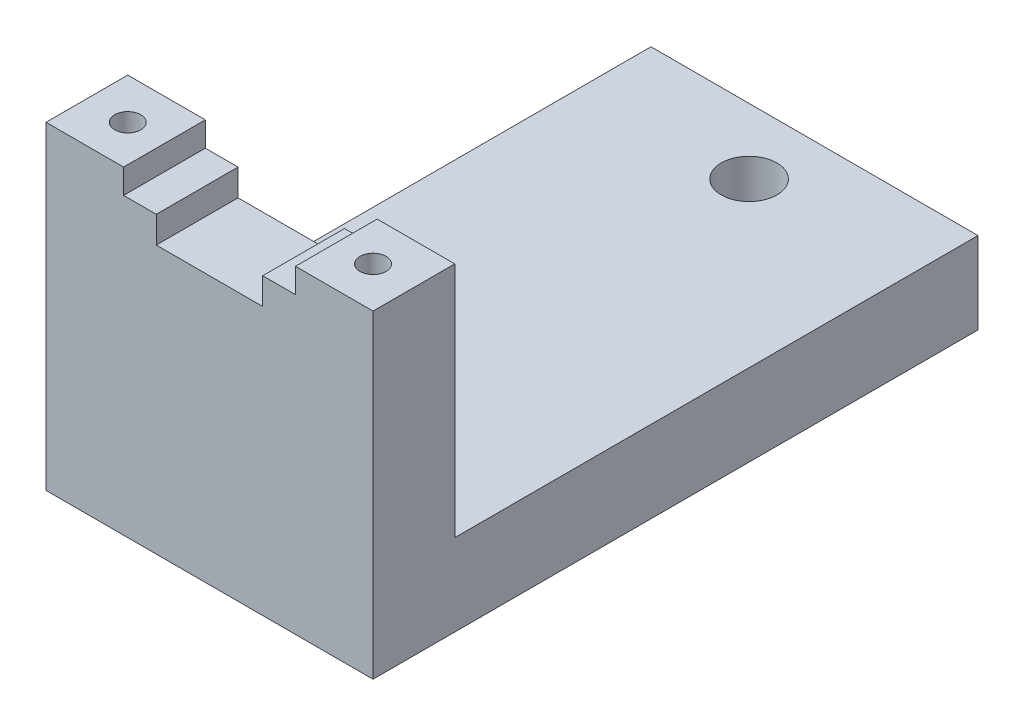
ISO-10303-21;
HEADER;
FILE_DESCRIPTION(('STEP AP214'),'2;1');
FILE_NAME('part.step','',(''),(''),'','','');
FILE_SCHEMA(('AUTOMOTIVE_DESIGN { 1 0 10303 214 1 1 1 1 }'));
ENDSEC;
DATA;
#1=APPLICATION_CONTEXT('core data for automotive mechanical design processes');
#2=APPLICATION_PROTOCOL_DEFINITION('international standard','automotive_design',2000,#1);
#3=PRODUCT_CONTEXT('',#1,'mechanical');
#4=PRODUCT('Part','Part','',(#3));
#5=PRODUCT_RELATED_PRODUCT_CATEGORY('part','',(#4));
#6=PRODUCT_DEFINITION_FORMATION('','',#4);
#7=PRODUCT_DEFINITION_CONTEXT('part definition',#1,'design');
#8=PRODUCT_DEFINITION('design','',#6,#7);
#9=PRODUCT_DEFINITION_SHAPE('','',#8);
#10=(LENGTH_UNIT() NAMED_UNIT(*) SI_UNIT(.MILLI.,.METRE.));
#11=(NAMED_UNIT(*) PLANE_ANGLE_UNIT() SI_UNIT($,.RADIAN.));
#12=(NAMED_UNIT(*) SI_UNIT($,.STERADIAN.) SOLID_ANGLE_UNIT());
#13=UNCERTAINTY_MEASURE_WITH_UNIT(LENGTH_MEASURE(1.E-05),#10,'distance_accuracy_value','');
#14=(GEOMETRIC_REPRESENTATION_CONTEXT(3) GLOBAL_UNCERTAINTY_ASSIGNED_CONTEXT((#13)) GLOBAL_UNIT_ASSIGNED_CONTEXT((#10,
#11,#12)) REPRESENTATION_CONTEXT('',''));
#15=CARTESIAN_POINT('',(0.,0.,0.));
#16=DIRECTION('',(0.,0.,1.));
#17=DIRECTION('',(1.,0.,0.));
#18=AXIS2_PLACEMENT_3D('',#15,#16,#17);
#19=CARTESIAN_POINT('',(5.255,18.,13.5));
#20=DIRECTION('',(0.,-1.,0.));
#21=DIRECTION('',(0.,0.,-1.));
#22=AXIS2_PLACEMENT_3D('',#19,#20,#21);
#23=PLANE('',#22);
#24=DIRECTION('',(-1.,0.,0.));
#25=VECTOR('',#24,1.);
#26=CARTESIAN_POINT('',(-5.255,18.,13.5));
#27=LINE('',#26,#25);
#28=CARTESIAN_POINT('',(5.255,18.,13.5));
#29=VERTEX_POINT('',#28);
#30=CARTESIAN_POINT('',(3.255,18.,13.5));
#31=VERTEX_POINT('',#30);
#32=EDGE_CURVE('E183',#29,#31,#27,.T.);
#33=ORIENTED_EDGE('',*,*,#32,.T.);
#34=DIRECTION('',(0.,0.,-1.));
#35=VECTOR('',#34,1.);
#36=CARTESIAN_POINT('',(3.255,18.,18.5));
#37=LINE('',#36,#35);
#38=CARTESIAN_POINT('',(3.255,18.,18.5));
#39=VERTEX_POINT('',#38);
#40=EDGE_CURVE('E146',#39,#31,#37,.T.);
#41=ORIENTED_EDGE('',*,*,#40,.F.);
#42=DIRECTION('',(1.,0.,0.));
#43=VECTOR('',#42,1.);
#44=CARTESIAN_POINT('',(-5.255,18.,18.5));
#45=LINE('',#44,#43);
#46=CARTESIAN_POINT('',(5.255,18.,18.5));
#47=VERTEX_POINT('',#46);
#48=EDGE_CURVE('E188',#39,#47,#45,.T.);
#49=ORIENTED_EDGE('',*,*,#48,.T.);
#50=DIRECTION('',(0.,0.,-1.));
#51=VECTOR('',#50,1.);
#52=CARTESIAN_POINT('',(5.255,18.,18.5));
#53=LINE('',#52,#51);
#54=EDGE_CURVE('E178',#47,#29,#53,.T.);
#55=ORIENTED_EDGE('',*,*,#54,.T.);
#56=EDGE_LOOP('',(#33,#41,#49,#55));
#57=FACE_BOUND('',#56,.T.);
#58=ADVANCED_FACE('F31',(#57),#23,.F.);
#59=CARTESIAN_POINT('',(-10.,19.5,13.5));
#60=DIRECTION('',(0.,-1.,0.));
#61=DIRECTION('',(0.,0.,-1.));
#62=AXIS2_PLACEMENT_3D('',#59,#60,#61);
#63=PLANE('',#62);
#64=CARTESIAN_POINT('',(7.5,19.5,16.));
#65=DIRECTION('',(0.,1.,0.));
#66=DIRECTION('',(0.,0.,1.));
#67=AXIS2_PLACEMENT_3D('',#64,#65,#66);
#68=CIRCLE('',#67,0.8);
#69=CARTESIAN_POINT('',(7.5,19.5,16.8));
#70=VERTEX_POINT('',#69);
#71=EDGE_CURVE('E197',#70,#70,#68,.T.);
#72=ORIENTED_EDGE('',*,*,#71,.F.);
#73=EDGE_LOOP('',(#72));
#74=FACE_BOUND('',#73,.T.);
#75=DIRECTION('',(-1.,0.,0.));
#76=VECTOR('',#75,1.);
#77=CARTESIAN_POINT('',(-10.,19.5,13.5));
#78=LINE('',#77,#76);
#79=CARTESIAN_POINT('',(10.,19.5,13.5));
#80=VERTEX_POINT('',#79);
#81=CARTESIAN_POINT('',(5.255,19.5,13.5));
#82=VERTEX_POINT('',#81);
#83=EDGE_CURVE('E226',#80,#82,#78,.T.);
#84=ORIENTED_EDGE('',*,*,#83,.T.);
#85=DIRECTION('',(0.,0.,-1.));
#86=VECTOR('',#85,1.);
#87=CARTESIAN_POINT('',(5.255,19.5,18.5));
#88=LINE('',#87,#86);
#89=CARTESIAN_POINT('',(5.255,19.5,18.5));
#90=VERTEX_POINT('',#89);
#91=EDGE_CURVE('E173',#90,#82,#88,.T.);
#92=ORIENTED_EDGE('',*,*,#91,.F.);
#93=DIRECTION('',(1.,0.,0.));
#94=VECTOR('',#93,1.);
#95=CARTESIAN_POINT('',(-10.,19.5,18.5));
#96=LINE('',#95,#94);
#97=CARTESIAN_POINT('',(10.,19.5,18.5));
#98=VERTEX_POINT('',#97);
#99=EDGE_CURVE('E219',#90,#98,#96,.T.);
#100=ORIENTED_EDGE('',*,*,#99,.T.);
#101=DIRECTION('',(0.,0.,-1.));
#102=VECTOR('',#101,1.);
#103=CARTESIAN_POINT('',(10.,19.5,18.5));
#104=LINE('',#103,#102);
#105=EDGE_CURVE('E223',#98,#80,#104,.T.);
#106=ORIENTED_EDGE('',*,*,#105,.T.);
#107=EDGE_LOOP('',(#84,#92,#100,#106));
#108=FACE_BOUND('',#107,.T.);
#109=ADVANCED_FACE('F326',(#74,#108),#63,.F.);
#110=CARTESIAN_POINT('',(10.,5.,-18.5));
#111=DIRECTION('',(0.,-1.,0.));
#112=DIRECTION('',(0.,0.,-1.));
#113=AXIS2_PLACEMENT_3D('',#110,#111,#112);
#114=PLANE('',#113);
#115=CARTESIAN_POINT('',(0.,5.,-14.5));
#116=DIRECTION('',(0.,-1.,0.));
#117=DIRECTION('',(0.,0.,-1.));
#118=AXIS2_PLACEMENT_3D('',#115,#116,#117);
#119=CIRCLE('',#118,1.7);
#120=CARTESIAN_POINT('',(0.,5.,-16.2));
#121=VERTEX_POINT('',#120);
#122=EDGE_CURVE('E257',#121,#121,#119,.T.);
#123=ORIENTED_EDGE('',*,*,#122,.T.);
#124=EDGE_LOOP('',(#123));
#125=FACE_BOUND('',#124,.T.);
#126=CARTESIAN_POINT('',(0.,5.,8.4));
#127=DIRECTION('',(0.,-1.,0.));
#128=DIRECTION('',(0.,0.,-1.));
#129=AXIS2_PLACEMENT_3D('',#126,#127,#128);
#130=CIRCLE('',#129,1.7);
#131=CARTESIAN_POINT('',(0.,5.,6.7));
#132=VERTEX_POINT('',#131);
#133=EDGE_CURVE('E249',#132,#132,#130,.T.);
#134=ORIENTED_EDGE('',*,*,#133,.T.);
#135=EDGE_LOOP('',(#134));
#136=FACE_BOUND('',#135,.T.);
#137=DIRECTION('',(-1.,0.,0.));
#138=VECTOR('',#137,1.);
#139=CARTESIAN_POINT('',(-10.,5.,13.5));
#140=LINE('',#139,#138);
#141=CARTESIAN_POINT('',(10.,5.,13.5));
#142=VERTEX_POINT('',#141);
#143=CARTESIAN_POINT('',(-10.,5.,13.5));
#144=VERTEX_POINT('',#143);
#145=EDGE_CURVE('E215',#142,#144,#140,.T.);
#146=ORIENTED_EDGE('',*,*,#145,.F.);
#147=DIRECTION('',(0.,0.,-1.));
#148=VECTOR('',#147,1.);
#149=CARTESIAN_POINT('',(10.,5.,18.5));
#150=LINE('',#149,#148);
#151=CARTESIAN_POINT('',(10.,5.,-18.5));
#152=VERTEX_POINT('',#151);
#153=EDGE_CURVE('E266',#142,#152,#150,.T.);
#154=ORIENTED_EDGE('',*,*,#153,.T.);
#155=DIRECTION('',(-1.,0.,0.));
#156=VECTOR('',#155,1.);
#157=CARTESIAN_POINT('',(-10.,5.,-18.5));
#158=LINE('',#157,#156);
#159=CARTESIAN_POINT('',(-10.,5.,-18.5));
#160=VERTEX_POINT('',#159);
#161=EDGE_CURVE('E265',#152,#160,#158,.T.);
#162=ORIENTED_EDGE('',*,*,#161,.T.);
#163=DIRECTION('',(0.,0.,1.));
#164=VECTOR('',#163,1.);
#165=CARTESIAN_POINT('',(-10.,5.,18.5));
#166=LINE('',#165,#164);
#167=EDGE_CURVE('E238',#160,#144,#166,.T.);
#168=ORIENTED_EDGE('',*,*,#167,.T.);
#169=EDGE_LOOP('',(#146,#154,#162,#168));
#170=FACE_BOUND('',#169,.T.);
#171=ADVANCED_FACE('F300',(#125,#136,#170),#114,.F.);
#172=CARTESIAN_POINT('',(10.,5.,18.5));
#173=DIRECTION('',(-1.,0.,0.));
#174=DIRECTION('',(0.,0.,1.));
#175=AXIS2_PLACEMENT_3D('',#172,#173,#174);
#176=PLANE('',#175);
#177=DIRECTION('',(0.,0.,-1.));
#178=VECTOR('',#177,1.);
#179=CARTESIAN_POINT('',(10.,0.,18.5));
#180=LINE('',#179,#178);
#181=CARTESIAN_POINT('',(10.,0.,18.5));
#182=VERTEX_POINT('',#181);
#183=CARTESIAN_POINT('',(10.,0.,-18.5));
#184=VERTEX_POINT('',#183);
#185=EDGE_CURVE('E262',#182,#184,#180,.T.);
#186=ORIENTED_EDGE('',*,*,#185,.T.);
#187=DIRECTION('',(0.,-1.,0.));
#188=VECTOR('',#187,1.);
#189=CARTESIAN_POINT('',(10.,5.,-18.5));
#190=LINE('',#189,#188);
#191=EDGE_CURVE('E11',#152,#184,#190,.T.);
#192=ORIENTED_EDGE('',*,*,#191,.F.);
#193=ORIENTED_EDGE('',*,*,#153,.F.);
#194=DIRECTION('',(0.,-1.,0.));
#195=VECTOR('',#194,1.);
#196=CARTESIAN_POINT('',(10.,19.5,13.5));
#197=LINE('',#196,#195);
#198=EDGE_CURVE('E243',#80,#142,#197,.T.);
#199=ORIENTED_EDGE('',*,*,#198,.F.);
#200=ORIENTED_EDGE('',*,*,#105,.F.);
#201=DIRECTION('',(0.,-1.,0.));
#202=VECTOR('',#201,1.);
#203=CARTESIAN_POINT('',(10.,5.,18.5));
#204=LINE('',#203,#202);
#205=EDGE_CURVE('E274',#98,#182,#204,.T.);
#206=ORIENTED_EDGE('',*,*,#205,.T.);
#207=EDGE_LOOP('',(#186,#192,#193,#199,#200,#206));
#208=FACE_BOUND('',#207,.T.);
#209=ADVANCED_FACE('F33',(#208),#176,.F.);
#210=CARTESIAN_POINT('',(-10.,5.,-18.5));
#211=DIRECTION('',(0.,0.,1.));
#212=DIRECTION('',(1.,0.,0.));
#213=AXIS2_PLACEMENT_3D('',#210,#211,#212);
#214=PLANE('',#213);
#215=DIRECTION('',(-1.,0.,0.));
#216=VECTOR('',#215,1.);
#217=CARTESIAN_POINT('',(-10.,0.,-18.5));
#218=LINE('',#217,#216);
#219=CARTESIAN_POINT('',(-10.,0.,-18.5));
#220=VERTEX_POINT('',#219);
#221=EDGE_CURVE('E280',#184,#220,#218,.T.);
#222=ORIENTED_EDGE('',*,*,#221,.T.);
#223=DIRECTION('',(0.,-1.,0.));
#224=VECTOR('',#223,1.);
#225=CARTESIAN_POINT('',(-10.,5.,-18.5));
#226=LINE('',#225,#224);
#227=EDGE_CURVE('E40',#160,#220,#226,.T.);
#228=ORIENTED_EDGE('',*,*,#227,.F.);
#229=ORIENTED_EDGE('',*,*,#161,.F.);
#230=ORIENTED_EDGE('',*,*,#191,.T.);
#231=EDGE_LOOP('',(#222,#228,#229,#230));
#232=FACE_BOUND('',#231,.T.);
#233=ADVANCED_FACE('F297',(#232),#214,.F.);
#234=CARTESIAN_POINT('',(-10.,5.,18.5));
#235=DIRECTION('',(1.,0.,0.));
#236=DIRECTION('',(0.,0.,-1.));
#237=AXIS2_PLACEMENT_3D('',#234,#235,#236);
#238=PLANE('',#237);
#239=DIRECTION('',(0.,0.,1.));
#240=VECTOR('',#239,1.);
#241=CARTESIAN_POINT('',(-10.,0.,18.5));
#242=LINE('',#241,#240);
#243=CARTESIAN_POINT('',(-10.,0.,18.5));
#244=VERTEX_POINT('',#243);
#245=EDGE_CURVE('E278',#220,#244,#242,.T.);
#246=ORIENTED_EDGE('',*,*,#245,.T.);
#247=DIRECTION('',(0.,-1.,0.));
#248=VECTOR('',#247,1.);
#249=CARTESIAN_POINT('',(-10.,5.,18.5));
#250=LINE('',#249,#248);
#251=CARTESIAN_POINT('',(-10.,19.5,18.5));
#252=VERTEX_POINT('',#251);
#253=EDGE_CURVE('E271',#252,#244,#250,.T.);
#254=ORIENTED_EDGE('',*,*,#253,.F.);
#255=DIRECTION('',(0.,0.,1.));
#256=VECTOR('',#255,1.);
#257=CARTESIAN_POINT('',(-10.,19.5,18.5));
#258=LINE('',#257,#256);
#259=CARTESIAN_POINT('',(-10.,19.5,13.5));
#260=VERTEX_POINT('',#259);
#261=EDGE_CURVE('E216',#260,#252,#258,.T.);
#262=ORIENTED_EDGE('',*,*,#261,.F.);
#263=DIRECTION('',(0.,-1.,0.));
#264=VECTOR('',#263,1.);
#265=CARTESIAN_POINT('',(-10.,19.5,13.5));
#266=LINE('',#265,#264);
#267=EDGE_CURVE('E229',#260,#144,#266,.T.);
#268=ORIENTED_EDGE('',*,*,#267,.T.);
#269=ORIENTED_EDGE('',*,*,#167,.F.);
#270=ORIENTED_EDGE('',*,*,#227,.T.);
#271=EDGE_LOOP('',(#246,#254,#262,#268,#269,#270));
#272=FACE_BOUND('',#271,.T.);
#273=ADVANCED_FACE('F305',(#272),#238,.F.);
#274=CARTESIAN_POINT('',(-10.,5.,18.5));
#275=DIRECTION('',(0.,0.,-1.));
#276=DIRECTION('',(-1.,0.,0.));
#277=AXIS2_PLACEMENT_3D('',#274,#275,#276);
#278=PLANE('',#277);
#279=ORIENTED_EDGE('',*,*,#48,.F.);
#280=DIRECTION('',(0.,1.,0.));
#281=VECTOR('',#280,1.);
#282=CARTESIAN_POINT('',(3.255,16.37,18.5));
#283=LINE('',#282,#281);
#284=CARTESIAN_POINT('',(3.255,16.37,18.5));
#285=VERTEX_POINT('',#284);
#286=EDGE_CURVE('E171',#285,#39,#283,.T.);
#287=ORIENTED_EDGE('',*,*,#286,.F.);
#288=DIRECTION('',(1.,0.,0.));
#289=VECTOR('',#288,1.);
#290=CARTESIAN_POINT('',(-3.255,16.37,18.5));
#291=LINE('',#290,#289);
#292=CARTESIAN_POINT('',(-3.255,16.37,18.5));
#293=VERTEX_POINT('',#292);
#294=EDGE_CURVE('E151',#293,#285,#291,.T.);
#295=ORIENTED_EDGE('',*,*,#294,.F.);
#296=DIRECTION('',(0.,1.,0.));
#297=VECTOR('',#296,1.);
#298=CARTESIAN_POINT('',(-3.255,16.37,18.5));
#299=LINE('',#298,#297);
#300=CARTESIAN_POINT('',(-3.255,18.,18.5));
#301=VERTEX_POINT('',#300);
#302=EDGE_CURVE('E174',#293,#301,#299,.T.);
#303=ORIENTED_EDGE('',*,*,#302,.T.);
#304=CARTESIAN_POINT('',(-5.255,18.,18.5));
#305=VERTEX_POINT('',#304);
#306=EDGE_CURVE('E189',#305,#301,#45,.T.);
#307=ORIENTED_EDGE('',*,*,#306,.F.);
#308=DIRECTION('',(0.,1.,0.));
#309=VECTOR('',#308,1.);
#310=CARTESIAN_POINT('',(-5.255,18.,18.5));
#311=LINE('',#310,#309);
#312=CARTESIAN_POINT('',(-5.255,19.5,18.5));
#313=VERTEX_POINT('',#312);
#314=EDGE_CURVE('E198',#305,#313,#311,.T.);
#315=ORIENTED_EDGE('',*,*,#314,.T.);
#316=EDGE_CURVE('E220',#252,#313,#96,.T.);
#317=ORIENTED_EDGE('',*,*,#316,.F.);
#318=ORIENTED_EDGE('',*,*,#253,.T.);
#319=DIRECTION('',(1.,0.,0.));
#320=VECTOR('',#319,1.);
#321=CARTESIAN_POINT('',(-10.,0.,18.5));
#322=LINE('',#321,#320);
#323=EDGE_CURVE('E267',#244,#182,#322,.T.);
#324=ORIENTED_EDGE('',*,*,#323,.T.);
#325=ORIENTED_EDGE('',*,*,#205,.F.);
#326=ORIENTED_EDGE('',*,*,#99,.F.);
#327=DIRECTION('',(0.,1.,0.));
#328=VECTOR('',#327,1.);
#329=CARTESIAN_POINT('',(5.255,18.,18.5));
#330=LINE('',#329,#328);
#331=EDGE_CURVE('E195',#47,#90,#330,.T.);
#332=ORIENTED_EDGE('',*,*,#331,.F.);
#333=EDGE_LOOP('',(#279,#287,#295,#303,#307,#315,#317,#318,#324,#325,#326,#332));
#334=FACE_BOUND('',#333,.T.);
#335=ADVANCED_FACE('F315',(#334),#278,.F.);
#336=CARTESIAN_POINT('',(10.,0.,-18.5));
#337=DIRECTION('',(0.,-1.,0.));
#338=DIRECTION('',(0.,0.,-1.));
#339=AXIS2_PLACEMENT_3D('',#336,#337,#338);
#340=PLANE('',#339);
#341=CARTESIAN_POINT('',(0.,0.,8.4));
#342=DIRECTION('',(0.,-1.,0.));
#343=DIRECTION('',(0.,0.,-1.));
#344=AXIS2_PLACEMENT_3D('',#341,#342,#343);
#345=CIRCLE('',#344,1.7);
#346=CARTESIAN_POINT('',(0.,0.,6.7));
#347=VERTEX_POINT('',#346);
#348=EDGE_CURVE('E232',#347,#347,#345,.T.);
#349=ORIENTED_EDGE('',*,*,#348,.F.);
#350=EDGE_LOOP('',(#349));
#351=FACE_BOUND('',#350,.T.);
#352=CARTESIAN_POINT('',(0.,0.,-14.5));
#353=DIRECTION('',(0.,-1.,0.));
#354=DIRECTION('',(0.,0.,-1.));
#355=AXIS2_PLACEMENT_3D('',#352,#353,#354);
#356=CIRCLE('',#355,1.7);
#357=CARTESIAN_POINT('',(0.,0.,-16.2));
#358=VERTEX_POINT('',#357);
#359=EDGE_CURVE('E253',#358,#358,#356,.T.);
#360=ORIENTED_EDGE('',*,*,#359,.F.);
#361=EDGE_LOOP('',(#360));
#362=FACE_BOUND('',#361,.T.);
#363=ORIENTED_EDGE('',*,*,#185,.F.);
#364=ORIENTED_EDGE('',*,*,#323,.F.);
#365=ORIENTED_EDGE('',*,*,#245,.F.);
#366=ORIENTED_EDGE('',*,*,#221,.F.);
#367=EDGE_LOOP('',(#363,#364,#365,#366));
#368=FACE_BOUND('',#367,.T.);
#369=ADVANCED_FACE('F292',(#351,#362,#368),#340,.T.);
#370=CARTESIAN_POINT('',(0.,0.,-14.5));
#371=DIRECTION('',(0.,-1.,0.));
#372=DIRECTION('',(0.,0.,-1.));
#373=AXIS2_PLACEMENT_3D('',#370,#371,#372);
#374=CYLINDRICAL_SURFACE('',#373,1.7);
#375=ORIENTED_EDGE('',*,*,#122,.F.);
#376=EDGE_LOOP('',(#375));
#377=FACE_BOUND('',#376,.T.);
#378=ORIENTED_EDGE('',*,*,#359,.T.);
#379=EDGE_LOOP('',(#378));
#380=FACE_BOUND('',#379,.T.);
#381=ADVANCED_FACE('F369',(#377,#380),#374,.F.);
#382=CARTESIAN_POINT('',(0.,0.,8.4));
#383=DIRECTION('',(0.,-1.,0.));
#384=DIRECTION('',(0.,0.,-1.));
#385=AXIS2_PLACEMENT_3D('',#382,#383,#384);
#386=CYLINDRICAL_SURFACE('',#385,1.7);
#387=ORIENTED_EDGE('',*,*,#133,.F.);
#388=EDGE_LOOP('',(#387));
#389=FACE_BOUND('',#388,.T.);
#390=ORIENTED_EDGE('',*,*,#348,.T.);
#391=EDGE_LOOP('',(#390));
#392=FACE_BOUND('',#391,.T.);
#393=ADVANCED_FACE('F366',(#389,#392),#386,.F.);
#394=CARTESIAN_POINT('',(-10.,19.5,13.5));
#395=DIRECTION('',(0.,0.,1.));
#396=DIRECTION('',(1.,0.,0.));
#397=AXIS2_PLACEMENT_3D('',#394,#395,#396);
#398=PLANE('',#397);
#399=DIRECTION('',(-1.,0.,0.));
#400=VECTOR('',#399,1.);
#401=CARTESIAN_POINT('',(-3.255,16.37,13.5));
#402=LINE('',#401,#400);
#403=CARTESIAN_POINT('',(3.255,16.37,13.5));
#404=VERTEX_POINT('',#403);
#405=CARTESIAN_POINT('',(-3.255,16.37,13.5));
#406=VERTEX_POINT('',#405);
#407=EDGE_CURVE('E157',#404,#406,#402,.T.);
#408=ORIENTED_EDGE('',*,*,#407,.F.);
#409=DIRECTION('',(0.,1.,0.));
#410=VECTOR('',#409,1.);
#411=CARTESIAN_POINT('',(3.255,16.37,13.5));
#412=LINE('',#411,#410);
#413=EDGE_CURVE('E140',#404,#31,#412,.T.);
#414=ORIENTED_EDGE('',*,*,#413,.T.);
#415=ORIENTED_EDGE('',*,*,#32,.F.);
#416=DIRECTION('',(0.,1.,0.));
#417=VECTOR('',#416,1.);
#418=CARTESIAN_POINT('',(5.255,18.,13.5));
#419=LINE('',#418,#417);
#420=EDGE_CURVE('E192',#29,#82,#419,.T.);
#421=ORIENTED_EDGE('',*,*,#420,.T.);
#422=ORIENTED_EDGE('',*,*,#83,.F.);
#423=ORIENTED_EDGE('',*,*,#198,.T.);
#424=ORIENTED_EDGE('',*,*,#145,.T.);
#425=ORIENTED_EDGE('',*,*,#267,.F.);
#426=CARTESIAN_POINT('',(-5.255,19.5,13.5));
#427=VERTEX_POINT('',#426);
#428=EDGE_CURVE('E225',#427,#260,#78,.T.);
#429=ORIENTED_EDGE('',*,*,#428,.F.);
#430=DIRECTION('',(0.,1.,0.));
#431=VECTOR('',#430,1.);
#432=CARTESIAN_POINT('',(-5.255,18.,13.5));
#433=LINE('',#432,#431);
#434=CARTESIAN_POINT('',(-5.255,18.,13.5));
#435=VERTEX_POINT('',#434);
#436=EDGE_CURVE('E56',#435,#427,#433,.T.);
#437=ORIENTED_EDGE('',*,*,#436,.F.);
#438=CARTESIAN_POINT('',(-3.25500000000001,18.,13.5));
#439=VERTEX_POINT('',#438);
#440=EDGE_CURVE('E181',#439,#435,#27,.T.);
#441=ORIENTED_EDGE('',*,*,#440,.F.);
#442=DIRECTION('',(0.,1.,0.));
#443=VECTOR('',#442,1.);
#444=CARTESIAN_POINT('',(-3.255,16.37,13.5));
#445=LINE('',#444,#443);
#446=EDGE_CURVE('E48',#406,#439,#445,.T.);
#447=ORIENTED_EDGE('',*,*,#446,.F.);
#448=EDGE_LOOP('',(#408,#414,#415,#421,#422,#423,#424,#425,#429,#437,#441,#447));
#449=FACE_BOUND('',#448,.T.);
#450=ADVANCED_FACE('F162',(#449),#398,.F.);
#451=CARTESIAN_POINT('',(-7.5,19.5,16.));
#452=DIRECTION('',(0.,1.,0.));
#453=DIRECTION('',(0.,0.,1.));
#454=AXIS2_PLACEMENT_3D('',#451,#452,#453);
#455=CIRCLE('',#454,0.799999999999999);
#456=CARTESIAN_POINT('',(-7.5,19.5,16.8));
#457=VERTEX_POINT('',#456);
#458=EDGE_CURVE('E209',#457,#457,#455,.T.);
#459=ORIENTED_EDGE('',*,*,#458,.F.);
#460=EDGE_LOOP('',(#459));
#461=FACE_BOUND('',#460,.T.);
#462=ORIENTED_EDGE('',*,*,#316,.T.);
#463=DIRECTION('',(0.,0.,1.));
#464=VECTOR('',#463,1.);
#465=CARTESIAN_POINT('',(-5.255,19.5,18.5));
#466=LINE('',#465,#464);
#467=EDGE_CURVE('E182',#427,#313,#466,.T.);
#468=ORIENTED_EDGE('',*,*,#467,.F.);
#469=ORIENTED_EDGE('',*,*,#428,.T.);
#470=ORIENTED_EDGE('',*,*,#261,.T.);
#471=EDGE_LOOP('',(#462,#468,#469,#470));
#472=FACE_BOUND('',#471,.T.);
#473=ADVANCED_FACE('F308',(#461,#472),#63,.F.);
#474=CARTESIAN_POINT('',(-7.5,11.3,16.));
#475=DIRECTION('',(0.,1.,0.));
#476=DIRECTION('',(0.,0.,1.));
#477=AXIS2_PLACEMENT_3D('',#474,#475,#476);
#478=CONICAL_SURFACE('',#477,0.799999999999999,1.02974425867665);
#479=CARTESIAN_POINT('',(-7.5,10.819311504778,16.));
#480=VERTEX_POINT('',#479);
#481=VERTEX_LOOP('',#480);
#482=FACE_BOUND('',#481,.T.);
#483=CARTESIAN_POINT('',(-7.5,11.3,16.));
#484=DIRECTION('',(0.,1.,0.));
#485=DIRECTION('',(0.,0.,1.));
#486=AXIS2_PLACEMENT_3D('',#483,#484,#485);
#487=CIRCLE('',#486,0.799999999999999);
#488=CARTESIAN_POINT('',(-7.5,11.3,16.8));
#489=VERTEX_POINT('',#488);
#490=EDGE_CURVE('E212',#489,#489,#487,.T.);
#491=ORIENTED_EDGE('',*,*,#490,.T.);
#492=EDGE_LOOP('',(#491));
#493=FACE_BOUND('',#492,.T.);
#494=ADVANCED_FACE('F357',(#482,#493),#478,.F.);
#495=CARTESIAN_POINT('',(-7.5,19.5,16.));
#496=DIRECTION('',(0.,1.,0.));
#497=DIRECTION('',(0.,0.,1.));
#498=AXIS2_PLACEMENT_3D('',#495,#496,#497);
#499=CYLINDRICAL_SURFACE('',#498,0.799999999999999);
#500=ORIENTED_EDGE('',*,*,#490,.F.);
#501=EDGE_LOOP('',(#500));
#502=FACE_BOUND('',#501,.T.);
#503=ORIENTED_EDGE('',*,*,#458,.T.);
#504=EDGE_LOOP('',(#503));
#505=FACE_BOUND('',#504,.T.);
#506=ADVANCED_FACE('F353',(#502,#505),#499,.F.);
#507=CARTESIAN_POINT('',(7.5,11.3,16.));
#508=DIRECTION('',(0.,1.,0.));
#509=DIRECTION('',(0.,0.,1.));
#510=AXIS2_PLACEMENT_3D('',#507,#508,#509);
#511=CONICAL_SURFACE('',#510,0.799999999999999,1.02974425867665);
#512=CARTESIAN_POINT('',(7.5,10.819311504778,16.));
#513=VERTEX_POINT('',#512);
#514=VERTEX_LOOP('',#513);
#515=FACE_BOUND('',#514,.T.);
#516=CARTESIAN_POINT('',(7.5,11.3,16.));
#517=DIRECTION('',(0.,1.,0.));
#518=DIRECTION('',(0.,0.,1.));
#519=AXIS2_PLACEMENT_3D('',#516,#517,#518);
#520=CIRCLE('',#519,0.799999999999999);
#521=CARTESIAN_POINT('',(7.5,11.3,16.8));
#522=VERTEX_POINT('',#521);
#523=EDGE_CURVE('E206',#522,#522,#520,.T.);
#524=ORIENTED_EDGE('',*,*,#523,.T.);
#525=EDGE_LOOP('',(#524));
#526=FACE_BOUND('',#525,.T.);
#527=ADVANCED_FACE('F349',(#515,#526),#511,.F.);
#528=CARTESIAN_POINT('',(7.5,19.5,16.));
#529=DIRECTION('',(0.,1.,0.));
#530=DIRECTION('',(0.,0.,1.));
#531=AXIS2_PLACEMENT_3D('',#528,#529,#530);
#532=CYLINDRICAL_SURFACE('',#531,0.799999999999999);
#533=ORIENTED_EDGE('',*,*,#523,.F.);
#534=EDGE_LOOP('',(#533));
#535=FACE_BOUND('',#534,.T.);
#536=ORIENTED_EDGE('',*,*,#71,.T.);
#537=EDGE_LOOP('',(#536));
#538=FACE_BOUND('',#537,.T.);
#539=ADVANCED_FACE('F343',(#535,#538),#532,.F.);
#540=CARTESIAN_POINT('',(5.255,18.,18.5));
#541=DIRECTION('',(1.,0.,0.));
#542=DIRECTION('',(0.,0.,-1.));
#543=AXIS2_PLACEMENT_3D('',#540,#541,#542);
#544=PLANE('',#543);
#545=ORIENTED_EDGE('',*,*,#91,.T.);
#546=ORIENTED_EDGE('',*,*,#420,.F.);
#547=ORIENTED_EDGE('',*,*,#54,.F.);
#548=ORIENTED_EDGE('',*,*,#331,.T.);
#549=EDGE_LOOP('',(#545,#546,#547,#548));
#550=FACE_BOUND('',#549,.T.);
#551=ADVANCED_FACE('F339',(#550),#544,.F.);
#552=CARTESIAN_POINT('',(-5.255,18.,18.5));
#553=DIRECTION('',(-1.,0.,0.));
#554=DIRECTION('',(0.,0.,1.));
#555=AXIS2_PLACEMENT_3D('',#552,#553,#554);
#556=PLANE('',#555);
#557=ORIENTED_EDGE('',*,*,#467,.T.);
#558=ORIENTED_EDGE('',*,*,#314,.F.);
#559=DIRECTION('',(0.,0.,1.));
#560=VECTOR('',#559,1.);
#561=CARTESIAN_POINT('',(-5.255,18.,18.5));
#562=LINE('',#561,#560);
#563=EDGE_CURVE('E185',#435,#305,#562,.T.);
#564=ORIENTED_EDGE('',*,*,#563,.F.);
#565=ORIENTED_EDGE('',*,*,#436,.T.);
#566=EDGE_LOOP('',(#557,#558,#564,#565));
#567=FACE_BOUND('',#566,.T.);
#568=ADVANCED_FACE('F312',(#567),#556,.F.);
#569=ORIENTED_EDGE('',*,*,#306,.T.);
#570=DIRECTION('',(0.,0.,1.));
#571=VECTOR('',#570,1.);
#572=CARTESIAN_POINT('',(-3.255,18.,18.5));
#573=LINE('',#572,#571);
#574=EDGE_CURVE('E160',#439,#301,#573,.T.);
#575=ORIENTED_EDGE('',*,*,#574,.F.);
#576=ORIENTED_EDGE('',*,*,#440,.T.);
#577=ORIENTED_EDGE('',*,*,#563,.T.);
#578=EDGE_LOOP('',(#569,#575,#576,#577));
#579=FACE_BOUND('',#578,.T.);
#580=ADVANCED_FACE('F310',(#579),#23,.F.);
#581=CARTESIAN_POINT('',(3.255,16.37,18.5));
#582=DIRECTION('',(1.,0.,0.));
#583=DIRECTION('',(0.,0.,-1.));
#584=AXIS2_PLACEMENT_3D('',#581,#582,#583);
#585=PLANE('',#584);
#586=ORIENTED_EDGE('',*,*,#40,.T.);
#587=ORIENTED_EDGE('',*,*,#413,.F.);
#588=DIRECTION('',(0.,0.,-1.));
#589=VECTOR('',#588,1.);
#590=CARTESIAN_POINT('',(3.255,16.37,18.5));
#591=LINE('',#590,#589);
#592=EDGE_CURVE('E143',#285,#404,#591,.T.);
#593=ORIENTED_EDGE('',*,*,#592,.F.);
#594=ORIENTED_EDGE('',*,*,#286,.T.);
#595=EDGE_LOOP('',(#586,#587,#593,#594));
#596=FACE_BOUND('',#595,.T.);
#597=ADVANCED_FACE('F142',(#596),#585,.F.);
#598=CARTESIAN_POINT('',(-3.255,16.37,18.5));
#599=DIRECTION('',(-1.,0.,0.));
#600=DIRECTION('',(0.,0.,1.));
#601=AXIS2_PLACEMENT_3D('',#598,#599,#600);
#602=PLANE('',#601);
#603=ORIENTED_EDGE('',*,*,#574,.T.);
#604=ORIENTED_EDGE('',*,*,#302,.F.);
#605=DIRECTION('',(0.,0.,1.));
#606=VECTOR('',#605,1.);
#607=CARTESIAN_POINT('',(-3.255,16.37,18.5));
#608=LINE('',#607,#606);
#609=EDGE_CURVE('E164',#406,#293,#608,.T.);
#610=ORIENTED_EDGE('',*,*,#609,.F.);
#611=ORIENTED_EDGE('',*,*,#446,.T.);
#612=EDGE_LOOP('',(#603,#604,#610,#611));
#613=FACE_BOUND('',#612,.T.);
#614=ADVANCED_FACE('F316',(#613),#602,.F.);
#615=CARTESIAN_POINT('',(3.255,16.37,13.5));
#616=DIRECTION('',(0.,-1.,0.));
#617=DIRECTION('',(0.,0.,-1.));
#618=AXIS2_PLACEMENT_3D('',#615,#616,#617);
#619=PLANE('',#618);
#620=ORIENTED_EDGE('',*,*,#592,.T.);
#621=ORIENTED_EDGE('',*,*,#407,.T.);
#622=ORIENTED_EDGE('',*,*,#609,.T.);
#623=ORIENTED_EDGE('',*,*,#294,.T.);
#624=EDGE_LOOP('',(#620,#621,#622,#623));
#625=FACE_BOUND('',#624,.T.);
#626=ADVANCED_FACE('F155',(#625),#619,.F.);
#627=CLOSED_SHELL('',(#58,#109,#171,#209,#233,#273,#335,#369,#381,#393,#450,#473,#494,#506,#527,
#539,#551,#568,#580,#597,#614,#626));
#628=MANIFOLD_SOLID_BREP('B2',#627);
#629=ADVANCED_BREP_SHAPE_REPRESENTATION('',(#18,#628),#14);
#630=SHAPE_DEFINITION_REPRESENTATION(#9,#629);
ENDSEC;
END-ISO-10303-21;
